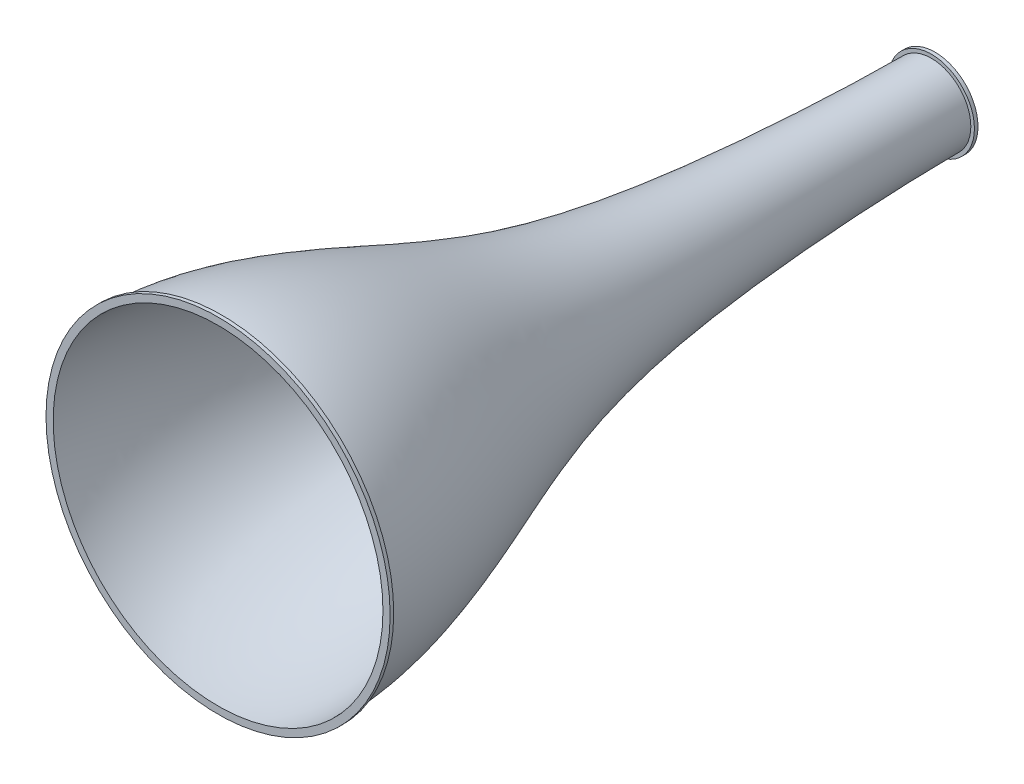
ISO-10303-21;
HEADER;
FILE_DESCRIPTION(('STEP AP214'),'2;1');
FILE_NAME('part.step','',(''),(''),'','','');
FILE_SCHEMA(('AUTOMOTIVE_DESIGN { 1 0 10303 214 1 1 1 1 }'));
ENDSEC;
DATA;
#1=APPLICATION_CONTEXT('core data for automotive mechanical design processes');
#2=APPLICATION_PROTOCOL_DEFINITION('international standard','automotive_design',2000,#1);
#3=PRODUCT_CONTEXT('',#1,'mechanical');
#4=PRODUCT('Part','Part','',(#3));
#5=PRODUCT_RELATED_PRODUCT_CATEGORY('part','',(#4));
#6=PRODUCT_DEFINITION_FORMATION('','',#4);
#7=PRODUCT_DEFINITION_CONTEXT('part definition',#1,'design');
#8=PRODUCT_DEFINITION('design','',#6,#7);
#9=PRODUCT_DEFINITION_SHAPE('','',#8);
#10=(LENGTH_UNIT() NAMED_UNIT(*) SI_UNIT(.MILLI.,.METRE.));
#11=(NAMED_UNIT(*) PLANE_ANGLE_UNIT() SI_UNIT($,.RADIAN.));
#12=(NAMED_UNIT(*) SI_UNIT($,.STERADIAN.) SOLID_ANGLE_UNIT());
#13=UNCERTAINTY_MEASURE_WITH_UNIT(LENGTH_MEASURE(1.E-05),#10,'distance_accuracy_value','');
#14=(GEOMETRIC_REPRESENTATION_CONTEXT(3) GLOBAL_UNCERTAINTY_ASSIGNED_CONTEXT((#13)) GLOBAL_UNIT_ASSIGNED_CONTEXT((#10,
#11,#12)) REPRESENTATION_CONTEXT('',''));
#15=CARTESIAN_POINT('',(0.,0.,0.));
#16=DIRECTION('',(0.,0.,1.));
#17=DIRECTION('',(1.,0.,0.));
#18=AXIS2_PLACEMENT_3D('',#15,#16,#17);
#19=CARTESIAN_POINT('',(0.,690.,0.));
#20=CARTESIAN_POINT('',(0.,690.,-500.));
#21=CARTESIAN_POINT('',(0.,422.698990130058,-1000.));
#22=CARTESIAN_POINT('',(0.,276.701099250173,-1200.));
#23=CARTESIAN_POINT('',(0.,212.934130749165,-1500.));
#24=CARTESIAN_POINT('',(0.,150.000000000002,-2400.));
#25=CARTESIAN_POINT('',(0.,150.,-3000.));
#26=B_SPLINE_CURVE_WITH_KNOTS('',6,(#19,#20,#21,#22,#23,#24,#25),.UNSPECIFIED.,.F.,.F.,(7,7),
(0.,1.),.UNSPECIFIED.);
#27=CARTESIAN_POINT('',(0.,0.,0.));
#28=DIRECTION('',(0.,0.,1.));
#29=AXIS1_PLACEMENT('',#27,#28);
#30=SURFACE_OF_REVOLUTION('',#26,#29);
#31=CARTESIAN_POINT('',(0.,0.,-3000.));
#32=DIRECTION('',(0.,0.,1.));
#33=DIRECTION('',(1.,0.,0.));
#34=AXIS2_PLACEMENT_3D('',#31,#32,#33);
#35=CIRCLE('',#34,150.);
#36=CARTESIAN_POINT('',(150.,0.,-3000.));
#37=VERTEX_POINT('',#36);
#38=EDGE_CURVE('E10',#37,#37,#35,.T.);
#39=ORIENTED_EDGE('',*,*,#38,.F.);
#40=EDGE_LOOP('',(#39));
#41=FACE_BOUND('',#40,.T.);
#42=CARTESIAN_POINT('',(0.,0.,0.));
#43=DIRECTION('',(0.,0.,1.));
#44=DIRECTION('',(1.,0.,0.));
#45=AXIS2_PLACEMENT_3D('',#42,#43,#44);
#46=CIRCLE('',#45,690.);
#47=CARTESIAN_POINT('',(690.,0.,0.));
#48=VERTEX_POINT('',#47);
#49=EDGE_CURVE('E70',#48,#48,#46,.T.);
#50=ORIENTED_EDGE('',*,*,#49,.T.);
#51=EDGE_LOOP('',(#50));
#52=FACE_BOUND('',#51,.T.);
#53=ADVANCED_FACE('F41',(#41,#52),#30,.T.);
#54=CARTESIAN_POINT('',(0.,150.,-3000.));
#55=DIRECTION('',(0.,0.,1.));
#56=DIRECTION('',(1.,0.,0.));
#57=AXIS2_PLACEMENT_3D('',#54,#55,#56);
#58=PLANE('',#57);
#59=CARTESIAN_POINT('',(0.,0.,-3000.));
#60=DIRECTION('',(0.,0.,1.));
#61=DIRECTION('',(1.,0.,0.));
#62=AXIS2_PLACEMENT_3D('',#59,#60,#61);
#63=CIRCLE('',#62,180.);
#64=CARTESIAN_POINT('',(180.,0.,-3000.));
#65=VERTEX_POINT('',#64);
#66=EDGE_CURVE('E48',#65,#65,#63,.T.);
#67=ORIENTED_EDGE('',*,*,#66,.F.);
#68=EDGE_LOOP('',(#67));
#69=FACE_BOUND('',#68,.T.);
#70=ORIENTED_EDGE('',*,*,#38,.T.);
#71=EDGE_LOOP('',(#70));
#72=FACE_BOUND('',#71,.T.);
#73=ADVANCED_FACE('F96',(#69,#72),#58,.F.);
#74=CARTESIAN_POINT('',(0.,0.,0.));
#75=DIRECTION('',(0.,0.,1.));
#76=DIRECTION('',(1.,0.,0.));
#77=AXIS2_PLACEMENT_3D('',#74,#75,#76);
#78=CYLINDRICAL_SURFACE('',#77,180.);
#79=CARTESIAN_POINT('',(0.,0.,-2985.));
#80=DIRECTION('',(0.,0.,1.));
#81=DIRECTION('',(1.,0.,0.));
#82=AXIS2_PLACEMENT_3D('',#79,#80,#81);
#83=CIRCLE('',#82,180.);
#84=CARTESIAN_POINT('',(180.,0.,-2985.));
#85=VERTEX_POINT('',#84);
#86=EDGE_CURVE('E52',#85,#85,#83,.T.);
#87=ORIENTED_EDGE('',*,*,#86,.F.);
#88=EDGE_LOOP('',(#87));
#89=FACE_BOUND('',#88,.T.);
#90=ORIENTED_EDGE('',*,*,#66,.T.);
#91=EDGE_LOOP('',(#90));
#92=FACE_BOUND('',#91,.T.);
#93=ADVANCED_FACE('F93',(#89,#92),#78,.T.);
#94=CARTESIAN_POINT('',(0.,165.016169718393,-2985.));
#95=DIRECTION('',(0.,0.,-1.));
#96=DIRECTION('',(-1.,0.,0.));
#97=AXIS2_PLACEMENT_3D('',#94,#95,#96);
#98=PLANE('',#97);
#99=CARTESIAN_POINT('',(0.,0.,-2985.));
#100=DIRECTION('',(0.,0.,1.));
#101=DIRECTION('',(1.,0.,0.));
#102=AXIS2_PLACEMENT_3D('',#99,#100,#101);
#103=CIRCLE('',#102,165.016169718393);
#104=CARTESIAN_POINT('',(165.016169718393,0.,-2985.));
#105=VERTEX_POINT('',#104);
#106=EDGE_CURVE('E56',#105,#105,#103,.T.);
#107=ORIENTED_EDGE('',*,*,#106,.F.);
#108=EDGE_LOOP('',(#107));
#109=FACE_BOUND('',#108,.T.);
#110=ORIENTED_EDGE('',*,*,#86,.T.);
#111=EDGE_LOOP('',(#110));
#112=FACE_BOUND('',#111,.T.);
#113=ADVANCED_FACE('F88',(#109,#112),#98,.F.);
#114=CARTESIAN_POINT('',(0.,165.016169718393,-2985.));
#115=CARTESIAN_POINT('',(0.,165.021189640365,-2982.65358344967));
#116=CARTESIAN_POINT('',(0.,165.033504597355,-2977.96842630878));
#117=CARTESIAN_POINT('',(0.,165.067365549252,-2968.53676971804));
#118=CARTESIAN_POINT('',(0.,165.126780965207,-2956.67696077117));
#119=CARTESIAN_POINT('',(0.,165.225052283824,-2942.32541213574));
#120=CARTESIAN_POINT('',(0.,165.391518376743,-2923.04297865477));
#121=CARTESIAN_POINT('',(0.,165.665103104582,-2898.67664240264));
#122=CARTESIAN_POINT('',(0.,166.095313466929,-2869.06166118661));
#123=CARTESIAN_POINT('',(0.,166.62470893324,-2839.11453269365));
#124=CARTESIAN_POINT('',(0.,167.459415698918,-2798.79769097351));
#125=CARTESIAN_POINT('',(0.,168.738309361767,-2747.77620554643));
#126=CARTESIAN_POINT('',(0.,170.632430665703,-2685.85078063428));
#127=CARTESIAN_POINT('',(0.,172.871141315955,-2623.50044940236));
#128=CARTESIAN_POINT('',(0.,175.441814467695,-2560.97632652919));
#129=CARTESIAN_POINT('',(0.,179.298229303736,-2477.68078096278));
#130=CARTESIAN_POINT('',(0.,184.900893120544,-2374.21633624373));
#131=CARTESIAN_POINT('',(0.,192.830047284155,-2252.50210298145));
#132=CARTESIAN_POINT('',(0.,201.946806146417,-2134.30032767802));
#133=CARTESIAN_POINT('',(0.,212.253983020989,-2020.39652508328));
#134=CARTESIAN_POINT('',(0.,223.771263834083,-1911.31932626251));
#135=CARTESIAN_POINT('',(0.,240.783301241952,-1772.69656685529));
#136=CARTESIAN_POINT('',(0.,265.250095265049,-1612.49583117056));
#137=CARTESIAN_POINT('',(0.,300.059133704047,-1439.79794835972));
#138=CARTESIAN_POINT('',(0.,340.53328707648,-1282.97019457776));
#139=CARTESIAN_POINT('',(0.,386.620394479308,-1136.93402792871));
#140=CARTESIAN_POINT('',(0.,437.817904848489,-995.922675803146));
#141=CARTESIAN_POINT('',(0.,492.943045535831,-854.223898336949));
#142=CARTESIAN_POINT('',(0.,549.887531445995,-706.836482236622));
#143=CARTESIAN_POINT('',(0.,596.169830425576,-576.14551222136));
#144=CARTESIAN_POINT('',(0.,630.188503905763,-465.930889871692));
#145=CARTESIAN_POINT('',(0.,653.466079753286,-380.432981165213));
#146=CARTESIAN_POINT('',(0.,673.695115474657,-292.211458182773));
#147=CARTESIAN_POINT('',(0.,689.943896431666,-201.563287236292));
#148=CARTESIAN_POINT('',(0.,699.292149618574,-124.38598287806));
#149=CARTESIAN_POINT('',(0.,703.660022025663,-62.0200303444307));
#150=CARTESIAN_POINT('',(0.,704.698260144453,-30.6660542214291));
#151=CARTESIAN_POINT('',(0.,704.902004828545,-15.));
#152=B_SPLINE_CURVE_WITH_KNOTS('',3,(#114,#115,#116,#117,#118,#119,#120,#121,#122,#123,#124,
#125,#126,#127,#128,#129,#130,#131,#132,#133,#134,#135,#136,#137,#138,#139,#140,#141,#142,#143,
#144,#145,#146,#147,#148,#149,#150,#151),.UNSPECIFIED.,.F.,.F.,(4,1,1,1,1,1,1,1,1,1,1,1,1,1,1,1,
1,1,1,1,1,1,1,1,1,1,1,1,1,1,1,1,1,1,1,4),(0.00493521639254143,0.00687058830555539,
0.00880596021856924,0.0126767040445971,0.016547447870625,0.0204181916966528,0.0281596793487085,
0.0359011670007642,0.0436426546528199,0.0513841423048756,0.066867117608987,0.0823500929130983,
0.0978330682172098,0.113316043521321,0.128799018825433,0.159764969433655,0.190730920041878,
0.221696870650101,0.252662821258324,0.283628771866547,0.314594722474769,0.376526623691215,
0.43845852490766,0.500390426124106,0.562322327340552,0.624254228556997,0.686186129773443,
0.748118030989888,0.810049932206334,0.841015882814557,0.871981833422779,0.902947784031002,
0.933913734639225,0.964879685247448,0.980362660551559,0.99584563585567),.UNSPECIFIED.);
#153=CARTESIAN_POINT('',(0.,0.,0.));
#154=DIRECTION('',(0.,0.,1.));
#155=AXIS1_PLACEMENT('',#153,#154);
#156=SURFACE_OF_REVOLUTION('',#152,#155);
#157=CARTESIAN_POINT('',(0.,0.,-15.));
#158=DIRECTION('',(0.,0.,1.));
#159=DIRECTION('',(1.,0.,0.));
#160=AXIS2_PLACEMENT_3D('',#157,#158,#159);
#161=CIRCLE('',#160,704.902004828545);
#162=CARTESIAN_POINT('',(704.902004828545,0.,-15.));
#163=VERTEX_POINT('',#162);
#164=EDGE_CURVE('E61',#163,#163,#161,.T.);
#165=ORIENTED_EDGE('',*,*,#164,.F.);
#166=EDGE_LOOP('',(#165));
#167=FACE_BOUND('',#166,.T.);
#168=ORIENTED_EDGE('',*,*,#106,.T.);
#169=EDGE_LOOP('',(#168));
#170=FACE_BOUND('',#169,.T.);
#171=ADVANCED_FACE('F83',(#167,#170),#156,.T.);
#172=CARTESIAN_POINT('',(0.,720.,-15.));
#173=DIRECTION('',(0.,0.,1.));
#174=DIRECTION('',(1.,0.,0.));
#175=AXIS2_PLACEMENT_3D('',#172,#173,#174);
#176=PLANE('',#175);
#177=CARTESIAN_POINT('',(0.,0.,-15.));
#178=DIRECTION('',(0.,0.,1.));
#179=DIRECTION('',(1.,0.,0.));
#180=AXIS2_PLACEMENT_3D('',#177,#178,#179);
#181=CIRCLE('',#180,720.);
#182=CARTESIAN_POINT('',(720.,0.,-15.));
#183=VERTEX_POINT('',#182);
#184=EDGE_CURVE('E64',#183,#183,#181,.T.);
#185=ORIENTED_EDGE('',*,*,#184,.F.);
#186=EDGE_LOOP('',(#185));
#187=FACE_BOUND('',#186,.T.);
#188=ORIENTED_EDGE('',*,*,#164,.T.);
#189=EDGE_LOOP('',(#188));
#190=FACE_BOUND('',#189,.T.);
#191=ADVANCED_FACE('F87',(#187,#190),#176,.F.);
#192=CARTESIAN_POINT('',(0.,0.,0.));
#193=DIRECTION('',(0.,0.,1.));
#194=DIRECTION('',(1.,0.,0.));
#195=AXIS2_PLACEMENT_3D('',#192,#193,#194);
#196=CYLINDRICAL_SURFACE('',#195,720.);
#197=CARTESIAN_POINT('',(0.,0.,0.));
#198=DIRECTION('',(0.,0.,1.));
#199=DIRECTION('',(1.,0.,0.));
#200=AXIS2_PLACEMENT_3D('',#197,#198,#199);
#201=CIRCLE('',#200,720.);
#202=CARTESIAN_POINT('',(720.,0.,0.));
#203=VERTEX_POINT('',#202);
#204=EDGE_CURVE('E67',#203,#203,#201,.T.);
#205=ORIENTED_EDGE('',*,*,#204,.F.);
#206=EDGE_LOOP('',(#205));
#207=FACE_BOUND('',#206,.T.);
#208=ORIENTED_EDGE('',*,*,#184,.T.);
#209=EDGE_LOOP('',(#208));
#210=FACE_BOUND('',#209,.T.);
#211=ADVANCED_FACE('F112',(#207,#210),#196,.T.);
#212=CARTESIAN_POINT('',(0.,720.,0.));
#213=DIRECTION('',(0.,0.,-1.));
#214=DIRECTION('',(-1.,0.,0.));
#215=AXIS2_PLACEMENT_3D('',#212,#213,#214);
#216=PLANE('',#215);
#217=ORIENTED_EDGE('',*,*,#49,.F.);
#218=EDGE_LOOP('',(#217));
#219=FACE_BOUND('',#218,.T.);
#220=ORIENTED_EDGE('',*,*,#204,.T.);
#221=EDGE_LOOP('',(#220));
#222=FACE_BOUND('',#221,.T.);
#223=ADVANCED_FACE('F109',(#219,#222),#216,.F.);
#224=CLOSED_SHELL('',(#53,#73,#93,#113,#171,#191,#211,#223));
#225=MANIFOLD_SOLID_BREP('B2',#224);
#226=ADVANCED_BREP_SHAPE_REPRESENTATION('',(#18,#225),#14);
#227=SHAPE_DEFINITION_REPRESENTATION(#9,#226);
ENDSEC;
END-ISO-10303-21;
